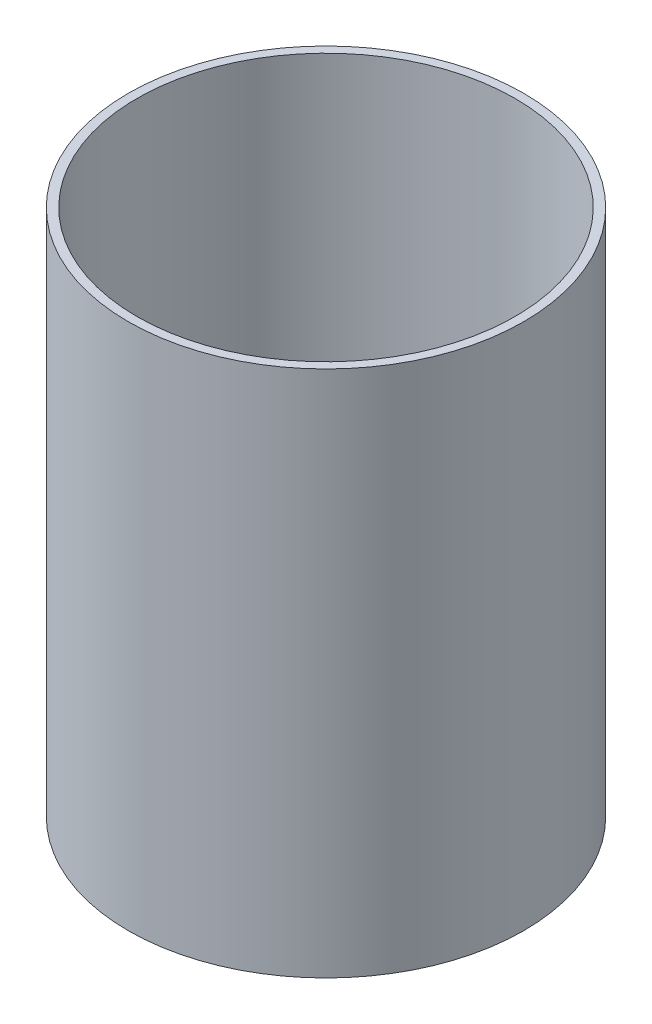
ISO-10303-21;
HEADER;
FILE_DESCRIPTION(('STEP AP214'),'2;1');
FILE_NAME('part.step','',(''),(''),'','','');
FILE_SCHEMA(('AUTOMOTIVE_DESIGN { 1 0 10303 214 1 1 1 1 }'));
ENDSEC;
DATA;
#1=APPLICATION_CONTEXT('core data for automotive mechanical design processes');
#2=APPLICATION_PROTOCOL_DEFINITION('international standard','automotive_design',2000,#1);
#3=PRODUCT_CONTEXT('',#1,'mechanical');
#4=PRODUCT('Part','Part','',(#3));
#5=PRODUCT_RELATED_PRODUCT_CATEGORY('part','',(#4));
#6=PRODUCT_DEFINITION_FORMATION('','',#4);
#7=PRODUCT_DEFINITION_CONTEXT('part definition',#1,'design');
#8=PRODUCT_DEFINITION('design','',#6,#7);
#9=PRODUCT_DEFINITION_SHAPE('','',#8);
#10=(LENGTH_UNIT() NAMED_UNIT(*) SI_UNIT(.MILLI.,.METRE.));
#11=(NAMED_UNIT(*) PLANE_ANGLE_UNIT() SI_UNIT($,.RADIAN.));
#12=(NAMED_UNIT(*) SI_UNIT($,.STERADIAN.) SOLID_ANGLE_UNIT());
#13=UNCERTAINTY_MEASURE_WITH_UNIT(LENGTH_MEASURE(1.E-05),#10,'distance_accuracy_value','');
#14=(GEOMETRIC_REPRESENTATION_CONTEXT(3) GLOBAL_UNCERTAINTY_ASSIGNED_CONTEXT((#13)) GLOBAL_UNIT_ASSIGNED_CONTEXT((#10,
#11,#12)) REPRESENTATION_CONTEXT('',''));
#15=CARTESIAN_POINT('',(0.,0.,0.));
#16=DIRECTION('',(0.,0.,1.));
#17=DIRECTION('',(1.,0.,0.));
#18=AXIS2_PLACEMENT_3D('',#15,#16,#17);
#19=CARTESIAN_POINT('',(0.,120.,0.));
#20=DIRECTION('',(0.,-1.,0.));
#21=DIRECTION('',(0.,0.,-1.));
#22=AXIS2_PLACEMENT_3D('',#19,#20,#21);
#23=CYLINDRICAL_SURFACE('',#22,45.);
#24=CARTESIAN_POINT('',(0.,120.,0.));
#25=DIRECTION('',(0.,1.,0.));
#26=DIRECTION('',(0.,0.,1.));
#27=AXIS2_PLACEMENT_3D('',#24,#25,#26);
#28=CIRCLE('',#27,45.);
#29=CARTESIAN_POINT('',(0.,120.,45.));
#30=VERTEX_POINT('',#29);
#31=EDGE_CURVE('E10',#30,#30,#28,.T.);
#32=ORIENTED_EDGE('',*,*,#31,.F.);
#33=EDGE_LOOP('',(#32));
#34=FACE_BOUND('',#33,.T.);
#35=CARTESIAN_POINT('',(0.,0.,0.));
#36=DIRECTION('',(0.,1.,0.));
#37=DIRECTION('',(0.,0.,1.));
#38=AXIS2_PLACEMENT_3D('',#35,#36,#37);
#39=CIRCLE('',#38,45.);
#40=CARTESIAN_POINT('',(0.,0.,45.));
#41=VERTEX_POINT('',#40);
#42=EDGE_CURVE('E42',#41,#41,#39,.T.);
#43=ORIENTED_EDGE('',*,*,#42,.T.);
#44=EDGE_LOOP('',(#43));
#45=FACE_BOUND('',#44,.T.);
#46=ADVANCED_FACE('F41',(#34,#45),#23,.T.);
#47=CARTESIAN_POINT('',(0.,120.,0.));
#48=DIRECTION('',(0.,1.,0.));
#49=DIRECTION('',(0.,0.,1.));
#50=AXIS2_PLACEMENT_3D('',#47,#48,#49);
#51=PLANE('',#50);
#52=CARTESIAN_POINT('',(0.,120.,0.));
#53=DIRECTION('',(0.,1.,0.));
#54=DIRECTION('',(0.,0.,1.));
#55=AXIS2_PLACEMENT_3D('',#52,#53,#54);
#56=CIRCLE('',#55,43.);
#57=CARTESIAN_POINT('',(0.,120.,43.));
#58=VERTEX_POINT('',#57);
#59=EDGE_CURVE('E52',#58,#58,#56,.T.);
#60=ORIENTED_EDGE('',*,*,#59,.F.);
#61=EDGE_LOOP('',(#60));
#62=FACE_BOUND('',#61,.T.);
#63=ORIENTED_EDGE('',*,*,#31,.T.);
#64=EDGE_LOOP('',(#63));
#65=FACE_BOUND('',#64,.T.);
#66=ADVANCED_FACE('F66',(#62,#65),#51,.T.);
#67=CARTESIAN_POINT('',(0.,0.,0.));
#68=DIRECTION('',(0.,1.,0.));
#69=DIRECTION('',(0.,0.,1.));
#70=AXIS2_PLACEMENT_3D('',#67,#68,#69);
#71=PLANE('',#70);
#72=ORIENTED_EDGE('',*,*,#42,.F.);
#73=EDGE_LOOP('',(#72));
#74=FACE_BOUND('',#73,.T.);
#75=ADVANCED_FACE('F63',(#74),#71,.F.);
#76=CARTESIAN_POINT('',(0.,2.99999999999999,0.));
#77=DIRECTION('',(0.,1.,0.));
#78=DIRECTION('',(0.,0.,1.));
#79=AXIS2_PLACEMENT_3D('',#76,#77,#78);
#80=CYLINDRICAL_SURFACE('',#79,43.);
#81=CARTESIAN_POINT('',(0.,2.99999999999999,0.));
#82=DIRECTION('',(0.,1.,0.));
#83=DIRECTION('',(0.,0.,1.));
#84=AXIS2_PLACEMENT_3D('',#81,#82,#83);
#85=CIRCLE('',#84,43.);
#86=CARTESIAN_POINT('',(0.,2.99999999999999,43.));
#87=VERTEX_POINT('',#86);
#88=EDGE_CURVE('E51',#87,#87,#85,.T.);
#89=ORIENTED_EDGE('',*,*,#88,.F.);
#90=EDGE_LOOP('',(#89));
#91=FACE_BOUND('',#90,.T.);
#92=ORIENTED_EDGE('',*,*,#59,.T.);
#93=EDGE_LOOP('',(#92));
#94=FACE_BOUND('',#93,.T.);
#95=ADVANCED_FACE('F61',(#91,#94),#80,.F.);
#96=CARTESIAN_POINT('',(0.,2.99999999999999,0.));
#97=DIRECTION('',(0.,1.,0.));
#98=DIRECTION('',(0.,0.,1.));
#99=AXIS2_PLACEMENT_3D('',#96,#97,#98);
#100=PLANE('',#99);
#101=ORIENTED_EDGE('',*,*,#88,.T.);
#102=EDGE_LOOP('',(#101));
#103=FACE_BOUND('',#102,.T.);
#104=ADVANCED_FACE('F56',(#103),#100,.T.);
#105=CLOSED_SHELL('',(#46,#66,#75,#95,#104));
#106=MANIFOLD_SOLID_BREP('B2',#105);
#107=ADVANCED_BREP_SHAPE_REPRESENTATION('',(#18,#106),#14);
#108=SHAPE_DEFINITION_REPRESENTATION(#9,#107);
ENDSEC;
END-ISO-10303-21;
